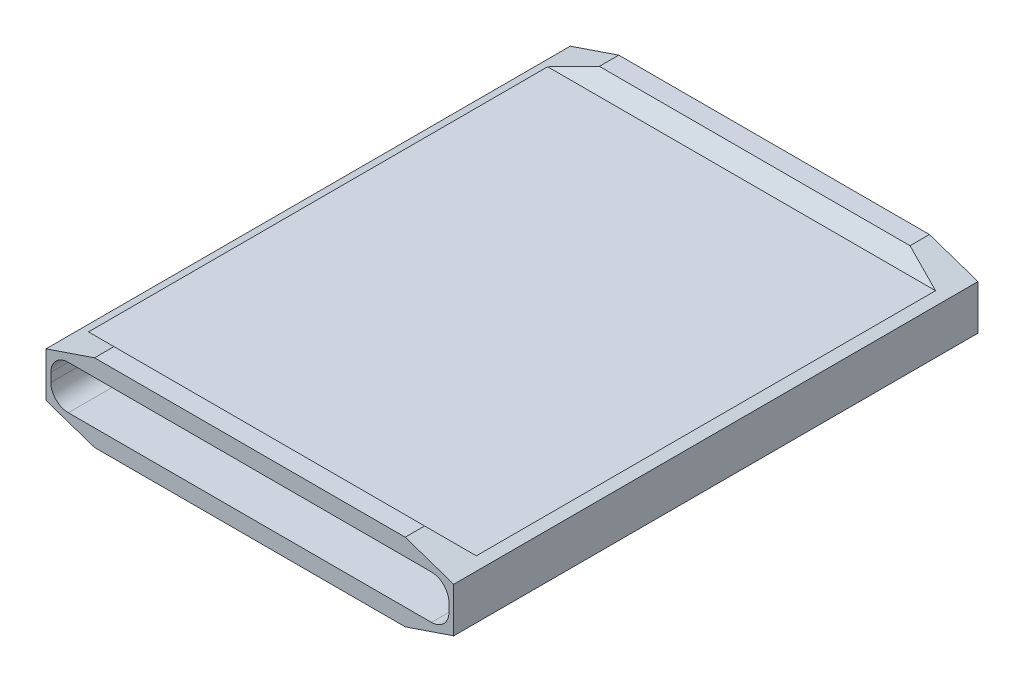
ISO-10303-21;
HEADER;
FILE_DESCRIPTION(('STEP AP214'),'2;1');
FILE_NAME('part.step','',(''),(''),'','','');
FILE_SCHEMA(('AUTOMOTIVE_DESIGN { 1 0 10303 214 1 1 1 1 }'));
ENDSEC;
DATA;
#1=APPLICATION_CONTEXT('core data for automotive mechanical design processes');
#2=APPLICATION_PROTOCOL_DEFINITION('international standard','automotive_design',2000,#1);
#3=PRODUCT_CONTEXT('',#1,'mechanical');
#4=PRODUCT('Part','Part','',(#3));
#5=PRODUCT_RELATED_PRODUCT_CATEGORY('part','',(#4));
#6=PRODUCT_DEFINITION_FORMATION('','',#4);
#7=PRODUCT_DEFINITION_CONTEXT('part definition',#1,'design');
#8=PRODUCT_DEFINITION('design','',#6,#7);
#9=PRODUCT_DEFINITION_SHAPE('','',#8);
#10=(LENGTH_UNIT() NAMED_UNIT(*) SI_UNIT(.MILLI.,.METRE.));
#11=(NAMED_UNIT(*) PLANE_ANGLE_UNIT() SI_UNIT($,.RADIAN.));
#12=(NAMED_UNIT(*) SI_UNIT($,.STERADIAN.) SOLID_ANGLE_UNIT());
#13=UNCERTAINTY_MEASURE_WITH_UNIT(LENGTH_MEASURE(1.E-05),#10,'distance_accuracy_value','');
#14=(GEOMETRIC_REPRESENTATION_CONTEXT(3) GLOBAL_UNCERTAINTY_ASSIGNED_CONTEXT((#13)) GLOBAL_UNIT_ASSIGNED_CONTEXT((#10,
#11,#12)) REPRESENTATION_CONTEXT('',''));
#15=CARTESIAN_POINT('',(0.,0.,0.));
#16=DIRECTION('',(0.,0.,1.));
#17=DIRECTION('',(1.,0.,0.));
#18=AXIS2_PLACEMENT_3D('',#15,#16,#17);
#19=CARTESIAN_POINT('',(-21.,4.,54.));
#20=DIRECTION('',(0.,-1.,0.));
#21=DIRECTION('',(0.,0.,-1.));
#22=AXIS2_PLACEMENT_3D('',#19,#20,#21);
#23=PLANE('',#22);
#24=DIRECTION('',(-1.,0.,0.));
#25=VECTOR('',#24,1.);
#26=CARTESIAN_POINT('',(-21.,4.,2.));
#27=LINE('',#26,#25);
#28=CARTESIAN_POINT('',(16.,4.,2.));
#29=VERTEX_POINT('',#28);
#30=CARTESIAN_POINT('',(-16.,4.,2.));
#31=VERTEX_POINT('',#30);
#32=EDGE_CURVE('E198',#29,#31,#27,.T.);
#33=ORIENTED_EDGE('',*,*,#32,.F.);
#34=DIRECTION('',(0.,0.,1.));
#35=VECTOR('',#34,1.);
#36=CARTESIAN_POINT('',(16.,4.,-0.001000000000001));
#37=LINE('',#36,#35);
#38=CARTESIAN_POINT('',(16.,4.,0.));
#39=VERTEX_POINT('',#38);
#40=EDGE_CURVE('E204',#39,#29,#37,.T.);
#41=ORIENTED_EDGE('',*,*,#40,.F.);
#42=DIRECTION('',(-1.,0.,0.));
#43=VECTOR('',#42,1.);
#44=CARTESIAN_POINT('',(-21.,4.,0.));
#45=LINE('',#44,#43);
#46=CARTESIAN_POINT('',(-16.,4.,0.));
#47=VERTEX_POINT('',#46);
#48=EDGE_CURVE('E282',#39,#47,#45,.T.);
#49=ORIENTED_EDGE('',*,*,#48,.T.);
#50=DIRECTION('',(0.,0.,1.));
#51=VECTOR('',#50,1.);
#52=CARTESIAN_POINT('',(-16.,4.,-0.001000000000001));
#53=LINE('',#52,#51);
#54=EDGE_CURVE('E207',#47,#31,#53,.T.);
#55=ORIENTED_EDGE('',*,*,#54,.T.);
#56=EDGE_LOOP('',(#33,#41,#49,#55));
#57=FACE_BOUND('',#56,.T.);
#58=ADVANCED_FACE('F36',(#57),#23,.F.);
#59=CARTESIAN_POINT('',(-21.,-4.,54.));
#60=DIRECTION('',(0.,1.,0.));
#61=DIRECTION('',(-1.,0.,0.));
#62=AXIS2_PLACEMENT_3D('',#59,#60,#61);
#63=PLANE('',#62);
#64=DIRECTION('',(1.,0.,0.));
#65=VECTOR('',#64,1.);
#66=CARTESIAN_POINT('',(-21.,-4.,2.));
#67=LINE('',#66,#65);
#68=CARTESIAN_POINT('',(-16.,-4.,2.));
#69=VERTEX_POINT('',#68);
#70=CARTESIAN_POINT('',(16.,-4.,2.));
#71=VERTEX_POINT('',#70);
#72=EDGE_CURVE('E208',#69,#71,#67,.T.);
#73=ORIENTED_EDGE('',*,*,#72,.F.);
#74=DIRECTION('',(0.,0.,1.));
#75=VECTOR('',#74,1.);
#76=CARTESIAN_POINT('',(-16.,-4.,-0.001000000000001));
#77=LINE('',#76,#75);
#78=CARTESIAN_POINT('',(-16.,-4.,0.));
#79=VERTEX_POINT('',#78);
#80=EDGE_CURVE('E239',#79,#69,#77,.T.);
#81=ORIENTED_EDGE('',*,*,#80,.F.);
#82=DIRECTION('',(1.,0.,0.));
#83=VECTOR('',#82,1.);
#84=CARTESIAN_POINT('',(-21.,-4.,0.));
#85=LINE('',#84,#83);
#86=CARTESIAN_POINT('',(16.,-4.,0.));
#87=VERTEX_POINT('',#86);
#88=EDGE_CURVE('E294',#79,#87,#85,.T.);
#89=ORIENTED_EDGE('',*,*,#88,.T.);
#90=DIRECTION('',(0.,0.,1.));
#91=VECTOR('',#90,1.);
#92=CARTESIAN_POINT('',(16.,-4.,-0.001000000000001));
#93=LINE('',#92,#91);
#94=EDGE_CURVE('E227',#87,#71,#93,.T.);
#95=ORIENTED_EDGE('',*,*,#94,.T.);
#96=EDGE_LOOP('',(#73,#81,#89,#95));
#97=FACE_BOUND('',#96,.T.);
#98=ADVANCED_FACE('F419',(#97),#63,.F.);
#99=CARTESIAN_POINT('',(0.,0.,54.));
#100=DIRECTION('',(0.,0.,1.));
#101=DIRECTION('',(1.,0.,0.));
#102=AXIS2_PLACEMENT_3D('',#99,#100,#101);
#103=PLANE('',#102);
#104=DIRECTION('',(1.,0.,0.));
#105=VECTOR('',#104,1.);
#106=CARTESIAN_POINT('',(-20.5,-2.25,54.));
#107=LINE('',#106,#105);
#108=CARTESIAN_POINT('',(-18.7,-2.25,54.));
#109=VERTEX_POINT('',#108);
#110=CARTESIAN_POINT('',(18.7,-2.25,54.));
#111=VERTEX_POINT('',#110);
#112=EDGE_CURVE('E257',#109,#111,#107,.T.);
#113=ORIENTED_EDGE('',*,*,#112,.F.);
#114=CARTESIAN_POINT('',(-18.7,-0.45,54.));
#115=DIRECTION('',(0.,0.,1.));
#116=DIRECTION('',(1.,0.,0.));
#117=AXIS2_PLACEMENT_3D('',#114,#115,#116);
#118=CIRCLE('',#117,1.8);
#119=CARTESIAN_POINT('',(-20.5,-0.45,54.));
#120=VERTEX_POINT('',#119);
#121=EDGE_CURVE('E330',#109,#120,#118,.F.);
#122=ORIENTED_EDGE('',*,*,#121,.T.);
#123=DIRECTION('',(0.,-1.,0.));
#124=VECTOR('',#123,1.);
#125=CARTESIAN_POINT('',(-20.5,2.25,54.));
#126=LINE('',#125,#124);
#127=CARTESIAN_POINT('',(-20.5,0.45,54.));
#128=VERTEX_POINT('',#127);
#129=EDGE_CURVE('E254',#128,#120,#126,.T.);
#130=ORIENTED_EDGE('',*,*,#129,.F.);
#131=CARTESIAN_POINT('',(-18.7,0.45,54.));
#132=DIRECTION('',(0.,0.,1.));
#133=DIRECTION('',(1.,0.,0.));
#134=AXIS2_PLACEMENT_3D('',#131,#132,#133);
#135=CIRCLE('',#134,1.8);
#136=CARTESIAN_POINT('',(-18.7,2.25,54.));
#137=VERTEX_POINT('',#136);
#138=EDGE_CURVE('E334',#128,#137,#135,.F.);
#139=ORIENTED_EDGE('',*,*,#138,.T.);
#140=DIRECTION('',(-1.,0.,0.));
#141=VECTOR('',#140,1.);
#142=CARTESIAN_POINT('',(-20.5,2.25,54.));
#143=LINE('',#142,#141);
#144=CARTESIAN_POINT('',(18.7,2.25,54.));
#145=VERTEX_POINT('',#144);
#146=EDGE_CURVE('E264',#145,#137,#143,.T.);
#147=ORIENTED_EDGE('',*,*,#146,.F.);
#148=CARTESIAN_POINT('',(18.7,0.449999999999999,54.));
#149=DIRECTION('',(0.,0.,1.));
#150=DIRECTION('',(1.,0.,0.));
#151=AXIS2_PLACEMENT_3D('',#148,#149,#150);
#152=CIRCLE('',#151,1.8);
#153=CARTESIAN_POINT('',(20.5,0.449999999999999,54.));
#154=VERTEX_POINT('',#153);
#155=EDGE_CURVE('E322',#145,#154,#152,.F.);
#156=ORIENTED_EDGE('',*,*,#155,.T.);
#157=DIRECTION('',(0.,1.,0.));
#158=VECTOR('',#157,1.);
#159=CARTESIAN_POINT('',(20.5,2.25,54.));
#160=LINE('',#159,#158);
#161=CARTESIAN_POINT('',(20.5,-0.45,54.));
#162=VERTEX_POINT('',#161);
#163=EDGE_CURVE('E261',#162,#154,#160,.T.);
#164=ORIENTED_EDGE('',*,*,#163,.F.);
#165=CARTESIAN_POINT('',(18.7,-0.45,54.));
#166=DIRECTION('',(0.,0.,1.));
#167=DIRECTION('',(1.,0.,0.));
#168=AXIS2_PLACEMENT_3D('',#165,#166,#167);
#169=CIRCLE('',#168,1.8);
#170=EDGE_CURVE('E326',#162,#111,#169,.F.);
#171=ORIENTED_EDGE('',*,*,#170,.T.);
#172=EDGE_LOOP('',(#113,#122,#130,#139,#147,#156,#164,#171));
#173=FACE_BOUND('',#172,.T.);
#174=DIRECTION('',(0.,1.,0.));
#175=VECTOR('',#174,1.);
#176=CARTESIAN_POINT('',(21.,4.,54.));
#177=LINE('',#176,#175);
#178=CARTESIAN_POINT('',(21.,-2.30217803813052,54.));
#179=VERTEX_POINT('',#178);
#180=CARTESIAN_POINT('',(21.,2.30217803813052,54.));
#181=VERTEX_POINT('',#180);
#182=EDGE_CURVE('E285',#179,#181,#177,.T.);
#183=ORIENTED_EDGE('',*,*,#182,.T.);
#184=DIRECTION('',(-0.946898382461237,0.321532973880275,0.));
#185=VECTOR('',#184,1.);
#186=CARTESIAN_POINT('',(16.,4.,54.));
#187=LINE('',#186,#185);
#188=CARTESIAN_POINT('',(16.,4.,54.));
#189=VERTEX_POINT('',#188);
#190=EDGE_CURVE('E217',#181,#189,#187,.T.);
#191=ORIENTED_EDGE('',*,*,#190,.T.);
#192=DIRECTION('',(-1.,0.,0.));
#193=VECTOR('',#192,1.);
#194=CARTESIAN_POINT('',(-21.,4.,54.));
#195=LINE('',#194,#193);
#196=CARTESIAN_POINT('',(-16.,4.,54.));
#197=VERTEX_POINT('',#196);
#198=EDGE_CURVE('E288',#189,#197,#195,.T.);
#199=ORIENTED_EDGE('',*,*,#198,.T.);
#200=DIRECTION('',(0.946898382461237,0.321532973880275,0.));
#201=VECTOR('',#200,1.);
#202=CARTESIAN_POINT('',(-16.,4.,54.));
#203=LINE('',#202,#201);
#204=CARTESIAN_POINT('',(-21.,2.30217803813052,54.));
#205=VERTEX_POINT('',#204);
#206=EDGE_CURVE('E246',#205,#197,#203,.T.);
#207=ORIENTED_EDGE('',*,*,#206,.F.);
#208=DIRECTION('',(0.,-1.,0.));
#209=VECTOR('',#208,1.);
#210=CARTESIAN_POINT('',(-21.,4.,54.));
#211=LINE('',#210,#209);
#212=CARTESIAN_POINT('',(-21.,-2.30217803813052,54.));
#213=VERTEX_POINT('',#212);
#214=EDGE_CURVE('E278',#205,#213,#211,.T.);
#215=ORIENTED_EDGE('',*,*,#214,.T.);
#216=DIRECTION('',(0.946898382461237,-0.321532973880275,0.));
#217=VECTOR('',#216,1.);
#218=CARTESIAN_POINT('',(-16.,-4.,54.));
#219=LINE('',#218,#217);
#220=CARTESIAN_POINT('',(-16.,-4.,54.));
#221=VERTEX_POINT('',#220);
#222=EDGE_CURVE('E230',#213,#221,#219,.T.);
#223=ORIENTED_EDGE('',*,*,#222,.T.);
#224=DIRECTION('',(1.,0.,0.));
#225=VECTOR('',#224,1.);
#226=CARTESIAN_POINT('',(-21.,-4.,54.));
#227=LINE('',#226,#225);
#228=CARTESIAN_POINT('',(16.,-4.,54.));
#229=VERTEX_POINT('',#228);
#230=EDGE_CURVE('E281',#221,#229,#227,.T.);
#231=ORIENTED_EDGE('',*,*,#230,.T.);
#232=DIRECTION('',(-0.946898382461237,-0.321532973880275,0.));
#233=VECTOR('',#232,1.);
#234=CARTESIAN_POINT('',(16.,-4.,54.));
#235=LINE('',#234,#233);
#236=EDGE_CURVE('E223',#179,#229,#235,.T.);
#237=ORIENTED_EDGE('',*,*,#236,.F.);
#238=EDGE_LOOP('',(#183,#191,#199,#207,#215,#223,#231,#237));
#239=FACE_BOUND('',#238,.T.);
#240=ADVANCED_FACE('F381',(#173,#239),#103,.T.);
#241=CARTESIAN_POINT('',(0.,0.,0.));
#242=DIRECTION('',(0.,0.,1.));
#243=DIRECTION('',(1.,0.,0.));
#244=AXIS2_PLACEMENT_3D('',#241,#242,#243);
#245=PLANE('',#244);
#246=DIRECTION('',(-1.,0.,0.));
#247=VECTOR('',#246,1.);
#248=CARTESIAN_POINT('',(-20.5,2.25,0.));
#249=LINE('',#248,#247);
#250=CARTESIAN_POINT('',(18.7,2.25,0.));
#251=VERTEX_POINT('',#250);
#252=CARTESIAN_POINT('',(-18.7,2.25,0.));
#253=VERTEX_POINT('',#252);
#254=EDGE_CURVE('E258',#251,#253,#249,.T.);
#255=ORIENTED_EDGE('',*,*,#254,.T.);
#256=CARTESIAN_POINT('',(-18.7,0.45,0.));
#257=DIRECTION('',(0.,0.,1.));
#258=DIRECTION('',(1.,0.,0.));
#259=AXIS2_PLACEMENT_3D('',#256,#257,#258);
#260=CIRCLE('',#259,1.8);
#261=CARTESIAN_POINT('',(-20.5,0.45,0.));
#262=VERTEX_POINT('',#261);
#263=EDGE_CURVE('E332',#253,#262,#260,.T.);
#264=ORIENTED_EDGE('',*,*,#263,.T.);
#265=DIRECTION('',(0.,-1.,0.));
#266=VECTOR('',#265,1.);
#267=CARTESIAN_POINT('',(-20.5,2.25,0.));
#268=LINE('',#267,#266);
#269=CARTESIAN_POINT('',(-20.5,-0.45,0.));
#270=VERTEX_POINT('',#269);
#271=EDGE_CURVE('E251',#262,#270,#268,.T.);
#272=ORIENTED_EDGE('',*,*,#271,.T.);
#273=CARTESIAN_POINT('',(-18.7,-0.45,0.));
#274=DIRECTION('',(0.,0.,1.));
#275=DIRECTION('',(1.,0.,0.));
#276=AXIS2_PLACEMENT_3D('',#273,#274,#275);
#277=CIRCLE('',#276,1.8);
#278=CARTESIAN_POINT('',(-18.7,-2.25,0.));
#279=VERTEX_POINT('',#278);
#280=EDGE_CURVE('E328',#270,#279,#277,.T.);
#281=ORIENTED_EDGE('',*,*,#280,.T.);
#282=DIRECTION('',(1.,0.,0.));
#283=VECTOR('',#282,1.);
#284=CARTESIAN_POINT('',(-20.5,-2.25,0.));
#285=LINE('',#284,#283);
#286=CARTESIAN_POINT('',(18.7,-2.25,0.));
#287=VERTEX_POINT('',#286);
#288=EDGE_CURVE('E270',#279,#287,#285,.T.);
#289=ORIENTED_EDGE('',*,*,#288,.T.);
#290=CARTESIAN_POINT('',(18.7,-0.45,0.));
#291=DIRECTION('',(0.,0.,1.));
#292=DIRECTION('',(1.,0.,0.));
#293=AXIS2_PLACEMENT_3D('',#290,#291,#292);
#294=CIRCLE('',#293,1.8);
#295=CARTESIAN_POINT('',(20.5,-0.45,0.));
#296=VERTEX_POINT('',#295);
#297=EDGE_CURVE('E324',#287,#296,#294,.T.);
#298=ORIENTED_EDGE('',*,*,#297,.T.);
#299=DIRECTION('',(0.,1.,0.));
#300=VECTOR('',#299,1.);
#301=CARTESIAN_POINT('',(20.5,2.25,0.));
#302=LINE('',#301,#300);
#303=CARTESIAN_POINT('',(20.5,0.449999999999999,0.));
#304=VERTEX_POINT('',#303);
#305=EDGE_CURVE('E273',#296,#304,#302,.T.);
#306=ORIENTED_EDGE('',*,*,#305,.T.);
#307=CARTESIAN_POINT('',(18.7,0.449999999999999,0.));
#308=DIRECTION('',(0.,0.,1.));
#309=DIRECTION('',(1.,0.,0.));
#310=AXIS2_PLACEMENT_3D('',#307,#308,#309);
#311=CIRCLE('',#310,1.8);
#312=EDGE_CURVE('E320',#304,#251,#311,.T.);
#313=ORIENTED_EDGE('',*,*,#312,.T.);
#314=EDGE_LOOP('',(#255,#264,#272,#281,#289,#298,#306,#313));
#315=FACE_BOUND('',#314,.T.);
#316=DIRECTION('',(0.946898382461237,-0.321532973880275,0.));
#317=VECTOR('',#316,1.);
#318=CARTESIAN_POINT('',(16.,4.,0.));
#319=LINE('',#318,#317);
#320=CARTESIAN_POINT('',(21.,2.30217803813052,0.));
#321=VERTEX_POINT('',#320);
#322=EDGE_CURVE('E212',#39,#321,#319,.T.);
#323=ORIENTED_EDGE('',*,*,#322,.T.);
#324=DIRECTION('',(0.,1.,0.));
#325=VECTOR('',#324,1.);
#326=CARTESIAN_POINT('',(21.,4.,0.));
#327=LINE('',#326,#325);
#328=CARTESIAN_POINT('',(21.,-2.30217803813052,0.));
#329=VERTEX_POINT('',#328);
#330=EDGE_CURVE('E297',#329,#321,#327,.T.);
#331=ORIENTED_EDGE('',*,*,#330,.F.);
#332=DIRECTION('',(0.946898382461237,0.321532973880275,0.));
#333=VECTOR('',#332,1.);
#334=CARTESIAN_POINT('',(16.,-4.,0.));
#335=LINE('',#334,#333);
#336=EDGE_CURVE('E221',#87,#329,#335,.T.);
#337=ORIENTED_EDGE('',*,*,#336,.F.);
#338=ORIENTED_EDGE('',*,*,#88,.F.);
#339=DIRECTION('',(-0.946898382461237,0.321532973880275,0.));
#340=VECTOR('',#339,1.);
#341=CARTESIAN_POINT('',(-16.,-4.,0.));
#342=LINE('',#341,#340);
#343=CARTESIAN_POINT('',(-21.,-2.30217803813052,0.));
#344=VERTEX_POINT('',#343);
#345=EDGE_CURVE('E238',#79,#344,#342,.T.);
#346=ORIENTED_EDGE('',*,*,#345,.T.);
#347=DIRECTION('',(0.,-1.,0.));
#348=VECTOR('',#347,1.);
#349=CARTESIAN_POINT('',(-21.,4.,0.));
#350=LINE('',#349,#348);
#351=CARTESIAN_POINT('',(-21.,2.30217803813052,0.));
#352=VERTEX_POINT('',#351);
#353=EDGE_CURVE('E267',#352,#344,#350,.T.);
#354=ORIENTED_EDGE('',*,*,#353,.F.);
#355=DIRECTION('',(-0.946898382461237,-0.321532973880275,0.));
#356=VECTOR('',#355,1.);
#357=CARTESIAN_POINT('',(-16.,4.,0.));
#358=LINE('',#357,#356);
#359=EDGE_CURVE('E244',#47,#352,#358,.T.);
#360=ORIENTED_EDGE('',*,*,#359,.F.);
#361=ORIENTED_EDGE('',*,*,#48,.F.);
#362=EDGE_LOOP('',(#323,#331,#337,#338,#346,#354,#360,#361));
#363=FACE_BOUND('',#362,.T.);
#364=ADVANCED_FACE('F388',(#315,#363),#245,.F.);
#365=CARTESIAN_POINT('',(21.,4.,54.));
#366=DIRECTION('',(-1.,0.,0.));
#367=DIRECTION('',(0.,-1.,0.));
#368=AXIS2_PLACEMENT_3D('',#365,#366,#367);
#369=PLANE('',#368);
#370=ORIENTED_EDGE('',*,*,#182,.F.);
#371=DIRECTION('',(0.,0.,1.));
#372=VECTOR('',#371,1.);
#373=CARTESIAN_POINT('',(21.,-2.30217803813052,-0.001000000000001));
#374=LINE('',#373,#372);
#375=EDGE_CURVE('E226',#329,#179,#374,.T.);
#376=ORIENTED_EDGE('',*,*,#375,.F.);
#377=ORIENTED_EDGE('',*,*,#330,.T.);
#378=DIRECTION('',(0.,0.,1.));
#379=VECTOR('',#378,1.);
#380=CARTESIAN_POINT('',(21.,2.30217803813052,-0.001000000000001));
#381=LINE('',#380,#379);
#382=EDGE_CURVE('E213',#321,#181,#381,.T.);
#383=ORIENTED_EDGE('',*,*,#382,.T.);
#384=EDGE_LOOP('',(#370,#376,#377,#383));
#385=FACE_BOUND('',#384,.T.);
#386=ADVANCED_FACE('F392',(#385),#369,.F.);
#387=CARTESIAN_POINT('',(16.,4.,52.));
#388=VERTEX_POINT('',#387);
#389=EDGE_CURVE('E214',#388,#189,#37,.T.);
#390=ORIENTED_EDGE('',*,*,#389,.F.);
#391=DIRECTION('',(-1.,0.,0.));
#392=VECTOR('',#391,1.);
#393=CARTESIAN_POINT('',(-21.,4.,52.));
#394=LINE('',#393,#392);
#395=CARTESIAN_POINT('',(-16.,4.,52.));
#396=VERTEX_POINT('',#395);
#397=EDGE_CURVE('E367',#388,#396,#394,.T.);
#398=ORIENTED_EDGE('',*,*,#397,.T.);
#399=EDGE_CURVE('E252',#396,#197,#53,.T.);
#400=ORIENTED_EDGE('',*,*,#399,.T.);
#401=ORIENTED_EDGE('',*,*,#198,.F.);
#402=EDGE_LOOP('',(#390,#398,#400,#401));
#403=FACE_BOUND('',#402,.T.);
#404=ADVANCED_FACE('F366',(#403),#23,.F.);
#405=CARTESIAN_POINT('',(-21.,4.,54.));
#406=DIRECTION('',(1.,0.,0.));
#407=DIRECTION('',(0.,0.,-1.));
#408=AXIS2_PLACEMENT_3D('',#405,#406,#407);
#409=PLANE('',#408);
#410=ORIENTED_EDGE('',*,*,#214,.F.);
#411=DIRECTION('',(0.,0.,1.));
#412=VECTOR('',#411,1.);
#413=CARTESIAN_POINT('',(-21.,2.30217803813052,-0.001000000000001));
#414=LINE('',#413,#412);
#415=EDGE_CURVE('E249',#352,#205,#414,.T.);
#416=ORIENTED_EDGE('',*,*,#415,.F.);
#417=ORIENTED_EDGE('',*,*,#353,.T.);
#418=DIRECTION('',(0.,0.,1.));
#419=VECTOR('',#418,1.);
#420=CARTESIAN_POINT('',(-21.,-2.30217803813052,-0.001000000000001));
#421=LINE('',#420,#419);
#422=EDGE_CURVE('E236',#344,#213,#421,.T.);
#423=ORIENTED_EDGE('',*,*,#422,.T.);
#424=EDGE_LOOP('',(#410,#416,#417,#423));
#425=FACE_BOUND('',#424,.T.);
#426=ADVANCED_FACE('F426',(#425),#409,.F.);
#427=CARTESIAN_POINT('',(-16.,-4.,52.));
#428=VERTEX_POINT('',#427);
#429=EDGE_CURVE('E235',#428,#221,#77,.T.);
#430=ORIENTED_EDGE('',*,*,#429,.F.);
#431=DIRECTION('',(1.,0.,0.));
#432=VECTOR('',#431,1.);
#433=CARTESIAN_POINT('',(-21.,-4.,52.));
#434=LINE('',#433,#432);
#435=CARTESIAN_POINT('',(16.,-4.,52.));
#436=VERTEX_POINT('',#435);
#437=EDGE_CURVE('E370',#428,#436,#434,.T.);
#438=ORIENTED_EDGE('',*,*,#437,.T.);
#439=EDGE_CURVE('E231',#436,#229,#93,.T.);
#440=ORIENTED_EDGE('',*,*,#439,.T.);
#441=ORIENTED_EDGE('',*,*,#230,.F.);
#442=EDGE_LOOP('',(#430,#438,#440,#441));
#443=FACE_BOUND('',#442,.T.);
#444=ADVANCED_FACE('F400',(#443),#63,.F.);
#445=CARTESIAN_POINT('',(-20.5,2.25,54.));
#446=DIRECTION('',(1.,0.,0.));
#447=DIRECTION('',(0.,0.,-1.));
#448=AXIS2_PLACEMENT_3D('',#445,#446,#447);
#449=PLANE('',#448);
#450=ORIENTED_EDGE('',*,*,#129,.T.);
#451=DIRECTION('',(0.,0.,-1.));
#452=VECTOR('',#451,1.);
#453=CARTESIAN_POINT('',(-20.5,-0.45,0.));
#454=LINE('',#453,#452);
#455=EDGE_CURVE('E317',#120,#270,#454,.T.);
#456=ORIENTED_EDGE('',*,*,#455,.T.);
#457=ORIENTED_EDGE('',*,*,#271,.F.);
#458=DIRECTION('',(0.,0.,-1.));
#459=VECTOR('',#458,1.);
#460=CARTESIAN_POINT('',(-20.5,0.45,54.));
#461=LINE('',#460,#459);
#462=EDGE_CURVE('E315',#262,#128,#461,.F.);
#463=ORIENTED_EDGE('',*,*,#462,.T.);
#464=EDGE_LOOP('',(#450,#456,#457,#463));
#465=FACE_BOUND('',#464,.T.);
#466=ADVANCED_FACE('F463',(#465),#449,.T.);
#467=CARTESIAN_POINT('',(-20.5,-2.25,54.));
#468=DIRECTION('',(0.,1.,0.));
#469=DIRECTION('',(-1.,0.,0.));
#470=AXIS2_PLACEMENT_3D('',#467,#468,#469);
#471=PLANE('',#470);
#472=ORIENTED_EDGE('',*,*,#112,.T.);
#473=DIRECTION('',(0.,0.,-1.));
#474=VECTOR('',#473,1.);
#475=CARTESIAN_POINT('',(18.7,-2.25,0.));
#476=LINE('',#475,#474);
#477=EDGE_CURVE('E312',#111,#287,#476,.T.);
#478=ORIENTED_EDGE('',*,*,#477,.T.);
#479=ORIENTED_EDGE('',*,*,#288,.F.);
#480=DIRECTION('',(0.,0.,-1.));
#481=VECTOR('',#480,1.);
#482=CARTESIAN_POINT('',(-18.7,-2.25,54.));
#483=LINE('',#482,#481);
#484=EDGE_CURVE('E310',#279,#109,#483,.F.);
#485=ORIENTED_EDGE('',*,*,#484,.T.);
#486=EDGE_LOOP('',(#472,#478,#479,#485));
#487=FACE_BOUND('',#486,.T.);
#488=ADVANCED_FACE('F580',(#487),#471,.T.);
#489=CARTESIAN_POINT('',(20.5,2.25,54.));
#490=DIRECTION('',(-1.,0.,0.));
#491=DIRECTION('',(0.,0.,1.));
#492=AXIS2_PLACEMENT_3D('',#489,#490,#491);
#493=PLANE('',#492);
#494=ORIENTED_EDGE('',*,*,#163,.T.);
#495=DIRECTION('',(0.,0.,-1.));
#496=VECTOR('',#495,1.);
#497=CARTESIAN_POINT('',(20.5,0.449999999999999,0.));
#498=LINE('',#497,#496);
#499=EDGE_CURVE('E302',#154,#304,#498,.T.);
#500=ORIENTED_EDGE('',*,*,#499,.T.);
#501=ORIENTED_EDGE('',*,*,#305,.F.);
#502=DIRECTION('',(0.,0.,-1.));
#503=VECTOR('',#502,1.);
#504=CARTESIAN_POINT('',(20.5,-0.45,54.));
#505=LINE('',#504,#503);
#506=EDGE_CURVE('E291',#296,#162,#505,.F.);
#507=ORIENTED_EDGE('',*,*,#506,.T.);
#508=EDGE_LOOP('',(#494,#500,#501,#507));
#509=FACE_BOUND('',#508,.T.);
#510=ADVANCED_FACE('F573',(#509),#493,.T.);
#511=CARTESIAN_POINT('',(-20.5,2.25,54.));
#512=DIRECTION('',(0.,-1.,0.));
#513=DIRECTION('',(1.,0.,0.));
#514=AXIS2_PLACEMENT_3D('',#511,#512,#513);
#515=PLANE('',#514);
#516=ORIENTED_EDGE('',*,*,#254,.F.);
#517=DIRECTION('',(0.,0.,-1.));
#518=VECTOR('',#517,1.);
#519=CARTESIAN_POINT('',(18.7,2.25,54.));
#520=LINE('',#519,#518);
#521=EDGE_CURVE('E308',#251,#145,#520,.F.);
#522=ORIENTED_EDGE('',*,*,#521,.T.);
#523=ORIENTED_EDGE('',*,*,#146,.T.);
#524=DIRECTION('',(0.,0.,-1.));
#525=VECTOR('',#524,1.);
#526=CARTESIAN_POINT('',(-18.7,2.25,0.));
#527=LINE('',#526,#525);
#528=EDGE_CURVE('E305',#137,#253,#527,.T.);
#529=ORIENTED_EDGE('',*,*,#528,.T.);
#530=EDGE_LOOP('',(#516,#522,#523,#529));
#531=FACE_BOUND('',#530,.T.);
#532=ADVANCED_FACE('F564',(#531),#515,.T.);
#533=CARTESIAN_POINT('',(-16.,4.,-0.001000000000001));
#534=DIRECTION('',(0.321532973880275,-0.946898382461237,0.));
#535=DIRECTION('',(0.946898382461237,0.321532973880275,0.));
#536=AXIS2_PLACEMENT_3D('',#533,#534,#535);
#537=PLANE('',#536);
#538=ORIENTED_EDGE('',*,*,#399,.F.);
#539=DIRECTION('',(-0.901446882733795,-0.306099262992844,-0.306099262992841));
#540=VECTOR('',#539,1.);
#541=CARTESIAN_POINT('',(-30.3487517066909,-0.872325154606402,47.1276748453936));
#542=LINE('',#541,#540);
#543=CARTESIAN_POINT('',(-19.9756818745397,2.65,50.65));
#544=VERTEX_POINT('',#543);
#545=EDGE_CURVE('E355',#396,#544,#542,.T.);
#546=ORIENTED_EDGE('',*,*,#545,.T.);
#547=DIRECTION('',(0.,0.,1.));
#548=VECTOR('',#547,1.);
#549=CARTESIAN_POINT('',(-19.9756818745397,2.65,-0.001000000000001));
#550=LINE('',#549,#548);
#551=CARTESIAN_POINT('',(-19.9756818745397,2.65,3.34999999999999));
#552=VERTEX_POINT('',#551);
#553=EDGE_CURVE('E371',#552,#544,#550,.T.);
#554=ORIENTED_EDGE('',*,*,#553,.F.);
#555=DIRECTION('',(-0.901446882733795,-0.306099262992844,0.306099262992842));
#556=VECTOR('',#555,1.);
#557=CARTESIAN_POINT('',(-15.4478596149096,4.18748721436833,1.81251278563168));
#558=LINE('',#557,#556);
#559=EDGE_CURVE('E13',#552,#31,#558,.F.);
#560=ORIENTED_EDGE('',*,*,#559,.T.);
#561=ORIENTED_EDGE('',*,*,#54,.F.);
#562=ORIENTED_EDGE('',*,*,#359,.T.);
#563=ORIENTED_EDGE('',*,*,#415,.T.);
#564=ORIENTED_EDGE('',*,*,#206,.T.);
#565=EDGE_LOOP('',(#538,#546,#554,#560,#561,#562,#563,#564));
#566=FACE_BOUND('',#565,.T.);
#567=ADVANCED_FACE('F428',(#566),#537,.F.);
#568=CARTESIAN_POINT('',(-16.,-4.,-0.001000000000001));
#569=DIRECTION('',(-0.321532973880275,-0.946898382461237,0.));
#570=DIRECTION('',(0.946898382461237,-0.321532973880275,0.));
#571=AXIS2_PLACEMENT_3D('',#568,#569,#570);
#572=PLANE('',#571);
#573=DIRECTION('',(0.,0.,1.));
#574=VECTOR('',#573,1.);
#575=CARTESIAN_POINT('',(-19.9756818745397,-2.65,-0.001000000000001));
#576=LINE('',#575,#574);
#577=CARTESIAN_POINT('',(-19.9756818745397,-2.65,3.34999999999999));
#578=VERTEX_POINT('',#577);
#579=CARTESIAN_POINT('',(-19.9756818745397,-2.65,50.65));
#580=VERTEX_POINT('',#579);
#581=EDGE_CURVE('E374',#578,#580,#576,.T.);
#582=ORIENTED_EDGE('',*,*,#581,.T.);
#583=DIRECTION('',(0.901446882733795,-0.306099262992844,0.306099262992841));
#584=VECTOR('',#583,1.);
#585=CARTESIAN_POINT('',(-2.99829628175237,-8.41491562291219,56.4149156229121));
#586=LINE('',#585,#584);
#587=EDGE_CURVE('E353',#580,#428,#586,.T.);
#588=ORIENTED_EDGE('',*,*,#587,.T.);
#589=ORIENTED_EDGE('',*,*,#429,.T.);
#590=ORIENTED_EDGE('',*,*,#222,.F.);
#591=ORIENTED_EDGE('',*,*,#422,.F.);
#592=ORIENTED_EDGE('',*,*,#345,.F.);
#593=ORIENTED_EDGE('',*,*,#80,.T.);
#594=DIRECTION('',(0.901446882733795,-0.306099262992844,-0.306099262992842));
#595=VECTOR('',#594,1.);
#596=CARTESIAN_POINT('',(-2.99829628175237,-8.41491562291219,-2.41491562291214));
#597=LINE('',#596,#595);
#598=EDGE_CURVE('E347',#69,#578,#597,.F.);
#599=ORIENTED_EDGE('',*,*,#598,.T.);
#600=EDGE_LOOP('',(#582,#588,#589,#590,#591,#592,#593,#599));
#601=FACE_BOUND('',#600,.T.);
#602=ADVANCED_FACE('F413',(#601),#572,.T.);
#603=CARTESIAN_POINT('',(16.,-4.,-0.001000000000001));
#604=DIRECTION('',(-0.321532973880275,0.946898382461237,0.));
#605=DIRECTION('',(-0.946898382461237,-0.321532973880275,0.));
#606=AXIS2_PLACEMENT_3D('',#603,#604,#605);
#607=PLANE('',#606);
#608=ORIENTED_EDGE('',*,*,#439,.F.);
#609=DIRECTION('',(0.901446882733795,0.306099262992844,-0.306099262992841));
#610=VECTOR('',#609,1.);
#611=CARTESIAN_POINT('',(30.3487517066909,0.872325154606402,47.1276748453936));
#612=LINE('',#611,#610);
#613=CARTESIAN_POINT('',(19.9756818745397,-2.65,50.65));
#614=VERTEX_POINT('',#613);
#615=EDGE_CURVE('E351',#436,#614,#612,.T.);
#616=ORIENTED_EDGE('',*,*,#615,.T.);
#617=DIRECTION('',(0.,0.,1.));
#618=VECTOR('',#617,1.);
#619=CARTESIAN_POINT('',(19.9756818745397,-2.65,-0.001000000000001));
#620=LINE('',#619,#618);
#621=CARTESIAN_POINT('',(19.9756818745397,-2.65,3.34999999999999));
#622=VERTEX_POINT('',#621);
#623=EDGE_CURVE('E338',#622,#614,#620,.T.);
#624=ORIENTED_EDGE('',*,*,#623,.F.);
#625=DIRECTION('',(0.901446882733795,0.306099262992844,0.306099262992842));
#626=VECTOR('',#625,1.);
#627=CARTESIAN_POINT('',(15.4478596149096,-4.18748721436833,1.81251278563168));
#628=LINE('',#627,#626);
#629=EDGE_CURVE('E349',#622,#71,#628,.F.);
#630=ORIENTED_EDGE('',*,*,#629,.T.);
#631=ORIENTED_EDGE('',*,*,#94,.F.);
#632=ORIENTED_EDGE('',*,*,#336,.T.);
#633=ORIENTED_EDGE('',*,*,#375,.T.);
#634=ORIENTED_EDGE('',*,*,#236,.T.);
#635=EDGE_LOOP('',(#608,#616,#624,#630,#631,#632,#633,#634));
#636=FACE_BOUND('',#635,.T.);
#637=ADVANCED_FACE('F395',(#636),#607,.F.);
#638=CARTESIAN_POINT('',(16.,4.,-0.001000000000001));
#639=DIRECTION('',(0.321532973880275,0.946898382461237,0.));
#640=DIRECTION('',(-0.946898382461237,0.321532973880275,0.));
#641=AXIS2_PLACEMENT_3D('',#638,#639,#640);
#642=PLANE('',#641);
#643=DIRECTION('',(0.,0.,1.));
#644=VECTOR('',#643,1.);
#645=CARTESIAN_POINT('',(19.9756818745397,2.65,-0.001000000000001));
#646=LINE('',#645,#644);
#647=CARTESIAN_POINT('',(19.9756818745397,2.65,3.34999999999999));
#648=VERTEX_POINT('',#647);
#649=CARTESIAN_POINT('',(19.9756818745397,2.65,50.65));
#650=VERTEX_POINT('',#649);
#651=EDGE_CURVE('E336',#648,#650,#646,.T.);
#652=ORIENTED_EDGE('',*,*,#651,.T.);
#653=DIRECTION('',(-0.901446882733795,0.306099262992844,0.306099262992841));
#654=VECTOR('',#653,1.);
#655=CARTESIAN_POINT('',(2.99829628175237,8.41491562291219,56.4149156229121));
#656=LINE('',#655,#654);
#657=EDGE_CURVE('E200',#650,#388,#656,.T.);
#658=ORIENTED_EDGE('',*,*,#657,.T.);
#659=ORIENTED_EDGE('',*,*,#389,.T.);
#660=ORIENTED_EDGE('',*,*,#190,.F.);
#661=ORIENTED_EDGE('',*,*,#382,.F.);
#662=ORIENTED_EDGE('',*,*,#322,.F.);
#663=ORIENTED_EDGE('',*,*,#40,.T.);
#664=DIRECTION('',(-0.901446882733795,0.306099262992844,-0.306099262992842));
#665=VECTOR('',#664,1.);
#666=CARTESIAN_POINT('',(2.99829628175237,8.41491562291219,-2.41491562291214));
#667=LINE('',#666,#665);
#668=EDGE_CURVE('E44',#29,#648,#667,.F.);
#669=ORIENTED_EDGE('',*,*,#668,.T.);
#670=EDGE_LOOP('',(#652,#658,#659,#660,#661,#662,#663,#669));
#671=FACE_BOUND('',#670,.T.);
#672=ADVANCED_FACE('F210',(#671),#642,.T.);
#673=CARTESIAN_POINT('',(18.7,0.449999999999999,54.));
#674=DIRECTION('',(0.,0.,1.));
#675=DIRECTION('',(1.,0.,0.));
#676=AXIS2_PLACEMENT_3D('',#673,#674,#675);
#677=CYLINDRICAL_SURFACE('',#676,1.8);
#678=ORIENTED_EDGE('',*,*,#155,.F.);
#679=ORIENTED_EDGE('',*,*,#521,.F.);
#680=ORIENTED_EDGE('',*,*,#312,.F.);
#681=ORIENTED_EDGE('',*,*,#499,.F.);
#682=EDGE_LOOP('',(#678,#679,#680,#681));
#683=FACE_BOUND('',#682,.T.);
#684=ADVANCED_FACE('F465',(#683),#677,.F.);
#685=CARTESIAN_POINT('',(18.7,-0.45,54.));
#686=DIRECTION('',(0.,0.,1.));
#687=DIRECTION('',(1.,0.,0.));
#688=AXIS2_PLACEMENT_3D('',#685,#686,#687);
#689=CYLINDRICAL_SURFACE('',#688,1.8);
#690=ORIENTED_EDGE('',*,*,#170,.F.);
#691=ORIENTED_EDGE('',*,*,#506,.F.);
#692=ORIENTED_EDGE('',*,*,#297,.F.);
#693=ORIENTED_EDGE('',*,*,#477,.F.);
#694=EDGE_LOOP('',(#690,#691,#692,#693));
#695=FACE_BOUND('',#694,.T.);
#696=ADVANCED_FACE('F468',(#695),#689,.F.);
#697=CARTESIAN_POINT('',(-18.7,-0.45,54.));
#698=DIRECTION('',(0.,0.,1.));
#699=DIRECTION('',(1.,0.,0.));
#700=AXIS2_PLACEMENT_3D('',#697,#698,#699);
#701=CYLINDRICAL_SURFACE('',#700,1.8);
#702=ORIENTED_EDGE('',*,*,#121,.F.);
#703=ORIENTED_EDGE('',*,*,#484,.F.);
#704=ORIENTED_EDGE('',*,*,#280,.F.);
#705=ORIENTED_EDGE('',*,*,#455,.F.);
#706=EDGE_LOOP('',(#702,#703,#704,#705));
#707=FACE_BOUND('',#706,.T.);
#708=ADVANCED_FACE('F440',(#707),#701,.F.);
#709=CARTESIAN_POINT('',(-18.7,0.45,54.));
#710=DIRECTION('',(0.,0.,1.));
#711=DIRECTION('',(1.,0.,0.));
#712=AXIS2_PLACEMENT_3D('',#709,#710,#711);
#713=CYLINDRICAL_SURFACE('',#712,1.8);
#714=ORIENTED_EDGE('',*,*,#138,.F.);
#715=ORIENTED_EDGE('',*,*,#462,.F.);
#716=ORIENTED_EDGE('',*,*,#263,.F.);
#717=ORIENTED_EDGE('',*,*,#528,.F.);
#718=EDGE_LOOP('',(#714,#715,#716,#717));
#719=FACE_BOUND('',#718,.T.);
#720=ADVANCED_FACE('F432',(#719),#713,.F.);
#721=CARTESIAN_POINT('',(21.,2.65,-45.4347884590798));
#722=DIRECTION('',(0.,1.,0.));
#723=DIRECTION('',(0.,0.,1.));
#724=AXIS2_PLACEMENT_3D('',#721,#722,#723);
#725=PLANE('',#724);
#726=ORIENTED_EDGE('',*,*,#553,.T.);
#727=DIRECTION('',(1.,0.,0.));
#728=VECTOR('',#727,1.);
#729=CARTESIAN_POINT('',(21.,2.65,50.65));
#730=LINE('',#729,#728);
#731=EDGE_CURVE('E51',#544,#650,#730,.T.);
#732=ORIENTED_EDGE('',*,*,#731,.T.);
#733=ORIENTED_EDGE('',*,*,#651,.F.);
#734=DIRECTION('',(-1.,0.,0.));
#735=VECTOR('',#734,1.);
#736=CARTESIAN_POINT('',(-19.9756818745397,2.65,3.34999999999999));
#737=LINE('',#736,#735);
#738=EDGE_CURVE('E199',#648,#552,#737,.T.);
#739=ORIENTED_EDGE('',*,*,#738,.T.);
#740=EDGE_LOOP('',(#726,#732,#733,#739));
#741=FACE_BOUND('',#740,.T.);
#742=ADVANCED_FACE('F430',(#741),#725,.T.);
#743=CARTESIAN_POINT('',(21.,-2.65,-45.4347884590798));
#744=DIRECTION('',(0.,-1.,0.));
#745=DIRECTION('',(0.,0.,-1.));
#746=AXIS2_PLACEMENT_3D('',#743,#744,#745);
#747=PLANE('',#746);
#748=ORIENTED_EDGE('',*,*,#581,.F.);
#749=DIRECTION('',(1.,0.,0.));
#750=VECTOR('',#749,1.);
#751=CARTESIAN_POINT('',(19.9756818745397,-2.65,3.34999999999999));
#752=LINE('',#751,#750);
#753=EDGE_CURVE('E343',#578,#622,#752,.T.);
#754=ORIENTED_EDGE('',*,*,#753,.T.);
#755=ORIENTED_EDGE('',*,*,#623,.T.);
#756=DIRECTION('',(-1.,0.,0.));
#757=VECTOR('',#756,1.);
#758=CARTESIAN_POINT('',(21.,-2.65,50.65));
#759=LINE('',#758,#757);
#760=EDGE_CURVE('E341',#614,#580,#759,.T.);
#761=ORIENTED_EDGE('',*,*,#760,.T.);
#762=EDGE_LOOP('',(#748,#754,#755,#761));
#763=FACE_BOUND('',#762,.T.);
#764=ADVANCED_FACE('F408',(#763),#747,.T.);
#765=CARTESIAN_POINT('',(0.,-4.,2.));
#766=DIRECTION('',(0.,-0.707106781186544,0.707106781186551));
#767=DIRECTION('',(1.,0.,0.));
#768=AXIS2_PLACEMENT_3D('',#765,#766,#767);
#769=PLANE('',#768);
#770=ORIENTED_EDGE('',*,*,#629,.F.);
#771=ORIENTED_EDGE('',*,*,#753,.F.);
#772=ORIENTED_EDGE('',*,*,#598,.F.);
#773=ORIENTED_EDGE('',*,*,#72,.T.);
#774=EDGE_LOOP('',(#770,#771,#772,#773));
#775=FACE_BOUND('',#774,.T.);
#776=ADVANCED_FACE('F415',(#775),#769,.T.);
#777=CARTESIAN_POINT('',(0.,-4.,52.));
#778=DIRECTION('',(0.,0.707106781186544,0.707106781186551));
#779=DIRECTION('',(1.,0.,0.));
#780=AXIS2_PLACEMENT_3D('',#777,#778,#779);
#781=PLANE('',#780);
#782=ORIENTED_EDGE('',*,*,#587,.F.);
#783=ORIENTED_EDGE('',*,*,#760,.F.);
#784=ORIENTED_EDGE('',*,*,#615,.F.);
#785=ORIENTED_EDGE('',*,*,#437,.F.);
#786=EDGE_LOOP('',(#782,#783,#784,#785));
#787=FACE_BOUND('',#786,.T.);
#788=ADVANCED_FACE('F411',(#787),#781,.F.);
#789=CARTESIAN_POINT('',(0.,4.,52.));
#790=DIRECTION('',(0.,-0.707106781186544,0.707106781186551));
#791=DIRECTION('',(-1.,0.,0.));
#792=AXIS2_PLACEMENT_3D('',#789,#790,#791);
#793=PLANE('',#792);
#794=ORIENTED_EDGE('',*,*,#657,.F.);
#795=ORIENTED_EDGE('',*,*,#731,.F.);
#796=ORIENTED_EDGE('',*,*,#545,.F.);
#797=ORIENTED_EDGE('',*,*,#397,.F.);
#798=EDGE_LOOP('',(#794,#795,#796,#797));
#799=FACE_BOUND('',#798,.T.);
#800=ADVANCED_FACE('F369',(#799),#793,.F.);
#801=CARTESIAN_POINT('',(0.,4.,2.));
#802=DIRECTION('',(0.,0.707106781186544,0.707106781186551));
#803=DIRECTION('',(-1.,0.,0.));
#804=AXIS2_PLACEMENT_3D('',#801,#802,#803);
#805=PLANE('',#804);
#806=ORIENTED_EDGE('',*,*,#559,.F.);
#807=ORIENTED_EDGE('',*,*,#738,.F.);
#808=ORIENTED_EDGE('',*,*,#668,.F.);
#809=ORIENTED_EDGE('',*,*,#32,.T.);
#810=EDGE_LOOP('',(#806,#807,#808,#809));
#811=FACE_BOUND('',#810,.T.);
#812=ADVANCED_FACE('F38',(#811),#805,.T.);
#813=CLOSED_SHELL('',(#58,#98,#240,#364,#386,#404,#426,#444,#466,#488,#510,#532,#567,#602,#637,
#672,#684,#696,#708,#720,#742,#764,#776,#788,#800,#812));
#814=MANIFOLD_SOLID_BREP('B2',#813);
#815=ADVANCED_BREP_SHAPE_REPRESENTATION('',(#18,#814),#14);
#816=SHAPE_DEFINITION_REPRESENTATION(#9,#815);
ENDSEC;
END-ISO-10303-21;
